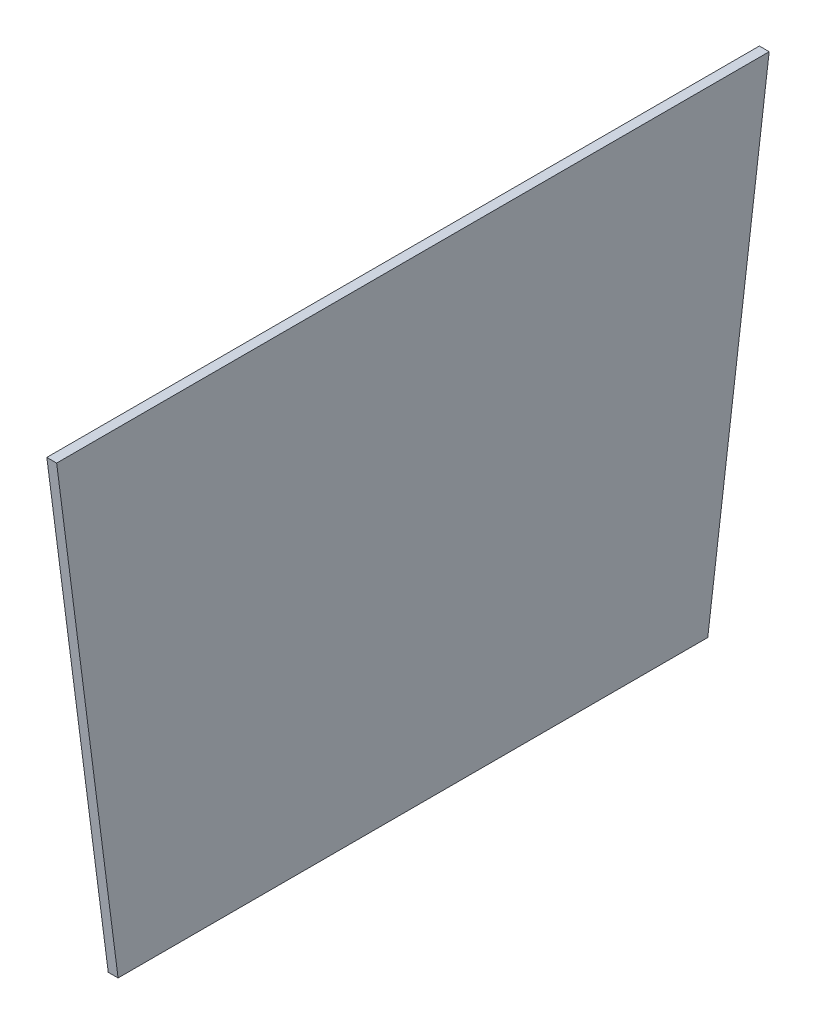
ISO-10303-21;
HEADER;
FILE_DESCRIPTION(('STEP AP214'),'2;1');
FILE_NAME('part.step','',(''),(''),'','','');
FILE_SCHEMA(('AUTOMOTIVE_DESIGN { 1 0 10303 214 1 1 1 1 }'));
ENDSEC;
DATA;
#1=APPLICATION_CONTEXT('core data for automotive mechanical design processes');
#2=APPLICATION_PROTOCOL_DEFINITION('international standard','automotive_design',2000,#1);
#3=PRODUCT_CONTEXT('',#1,'mechanical');
#4=PRODUCT('Part','Part','',(#3));
#5=PRODUCT_RELATED_PRODUCT_CATEGORY('part','',(#4));
#6=PRODUCT_DEFINITION_FORMATION('','',#4);
#7=PRODUCT_DEFINITION_CONTEXT('part definition',#1,'design');
#8=PRODUCT_DEFINITION('design','',#6,#7);
#9=PRODUCT_DEFINITION_SHAPE('','',#8);
#10=(LENGTH_UNIT() NAMED_UNIT(*) SI_UNIT(.MILLI.,.METRE.));
#11=(NAMED_UNIT(*) PLANE_ANGLE_UNIT() SI_UNIT($,.RADIAN.));
#12=(NAMED_UNIT(*) SI_UNIT($,.STERADIAN.) SOLID_ANGLE_UNIT());
#13=UNCERTAINTY_MEASURE_WITH_UNIT(LENGTH_MEASURE(1.E-05),#10,'distance_accuracy_value','');
#14=(GEOMETRIC_REPRESENTATION_CONTEXT(3) GLOBAL_UNCERTAINTY_ASSIGNED_CONTEXT((#13)) GLOBAL_UNIT_ASSIGNED_CONTEXT((#10,
#11,#12)) REPRESENTATION_CONTEXT('',''));
#15=CARTESIAN_POINT('',(0.,0.,0.));
#16=DIRECTION('',(0.,0.,1.));
#17=DIRECTION('',(1.,0.,0.));
#18=AXIS2_PLACEMENT_3D('',#15,#16,#17);
#19=CARTESIAN_POINT('',(5.08,0.,152.4));
#20=DIRECTION('',(0.,0.127809121680115,-0.991798784237689));
#21=DIRECTION('',(0.,0.991798784237689,0.127809121680115));
#22=AXIS2_PLACEMENT_3D('',#19,#20,#21);
#23=PLANE('',#22);
#24=DIRECTION('',(0.,-0.991798784237689,-0.127809121680115));
#25=VECTOR('',#24,1.);
#26=CARTESIAN_POINT('',(0.,0.,152.4));
#27=LINE('',#26,#25);
#28=CARTESIAN_POINT('',(0.,246.38,184.15));
#29=VERTEX_POINT('',#28);
#30=CARTESIAN_POINT('',(0.,0.,152.4));
#31=VERTEX_POINT('',#30);
#32=EDGE_CURVE('E101',#29,#31,#27,.T.);
#33=ORIENTED_EDGE('',*,*,#32,.T.);
#34=DIRECTION('',(-1.,0.,0.));
#35=VECTOR('',#34,1.);
#36=CARTESIAN_POINT('',(5.08,0.,152.4));
#37=LINE('',#36,#35);
#38=CARTESIAN_POINT('',(5.08,0.,152.4));
#39=VERTEX_POINT('',#38);
#40=EDGE_CURVE('E11',#39,#31,#37,.T.);
#41=ORIENTED_EDGE('',*,*,#40,.F.);
#42=DIRECTION('',(0.,-0.991798784237689,-0.127809121680115));
#43=VECTOR('',#42,1.);
#44=CARTESIAN_POINT('',(5.08,0.,152.4));
#45=LINE('',#44,#43);
#46=CARTESIAN_POINT('',(5.08,246.38,184.15));
#47=VERTEX_POINT('',#46);
#48=EDGE_CURVE('E89',#47,#39,#45,.T.);
#49=ORIENTED_EDGE('',*,*,#48,.F.);
#50=DIRECTION('',(-1.,0.,0.));
#51=VECTOR('',#50,1.);
#52=CARTESIAN_POINT('',(5.08,246.38,184.15));
#53=LINE('',#52,#51);
#54=EDGE_CURVE('E97',#47,#29,#53,.T.);
#55=ORIENTED_EDGE('',*,*,#54,.T.);
#56=EDGE_LOOP('',(#33,#41,#49,#55));
#57=FACE_BOUND('',#56,.T.);
#58=ADVANCED_FACE('F38',(#57),#23,.F.);
#59=CARTESIAN_POINT('',(5.08,0.,-152.4));
#60=DIRECTION('',(0.,1.,0.));
#61=DIRECTION('',(0.,0.,1.));
#62=AXIS2_PLACEMENT_3D('',#59,#60,#61);
#63=PLANE('',#62);
#64=DIRECTION('',(0.,0.,-1.));
#65=VECTOR('',#64,1.);
#66=CARTESIAN_POINT('',(0.,0.,-152.4));
#67=LINE('',#66,#65);
#68=CARTESIAN_POINT('',(0.,0.,-152.4));
#69=VERTEX_POINT('',#68);
#70=EDGE_CURVE('E93',#31,#69,#67,.T.);
#71=ORIENTED_EDGE('',*,*,#70,.T.);
#72=DIRECTION('',(-1.,0.,0.));
#73=VECTOR('',#72,1.);
#74=CARTESIAN_POINT('',(5.08,0.,-152.4));
#75=LINE('',#74,#73);
#76=CARTESIAN_POINT('',(5.08,0.,-152.4));
#77=VERTEX_POINT('',#76);
#78=EDGE_CURVE('E46',#77,#69,#75,.T.);
#79=ORIENTED_EDGE('',*,*,#78,.F.);
#80=DIRECTION('',(0.,0.,-1.));
#81=VECTOR('',#80,1.);
#82=CARTESIAN_POINT('',(5.08,0.,-152.4));
#83=LINE('',#82,#81);
#84=EDGE_CURVE('E84',#39,#77,#83,.T.);
#85=ORIENTED_EDGE('',*,*,#84,.F.);
#86=ORIENTED_EDGE('',*,*,#40,.T.);
#87=EDGE_LOOP('',(#71,#79,#85,#86));
#88=FACE_BOUND('',#87,.T.);
#89=ADVANCED_FACE('F92',(#88),#63,.F.);
#90=CARTESIAN_POINT('',(5.08,246.38,-184.15));
#91=DIRECTION('',(0.,0.127809121680115,0.991798784237689));
#92=DIRECTION('',(0.,-0.991798784237689,0.127809121680115));
#93=AXIS2_PLACEMENT_3D('',#90,#91,#92);
#94=PLANE('',#93);
#95=DIRECTION('',(0.,0.991798784237689,-0.127809121680115));
#96=VECTOR('',#95,1.);
#97=CARTESIAN_POINT('',(0.,246.38,-184.15));
#98=LINE('',#97,#96);
#99=CARTESIAN_POINT('',(0.,246.38,-184.15));
#100=VERTEX_POINT('',#99);
#101=EDGE_CURVE('E71',#69,#100,#98,.T.);
#102=ORIENTED_EDGE('',*,*,#101,.T.);
#103=DIRECTION('',(-1.,0.,0.));
#104=VECTOR('',#103,1.);
#105=CARTESIAN_POINT('',(5.08,246.38,-184.15));
#106=LINE('',#105,#104);
#107=CARTESIAN_POINT('',(5.08,246.38,-184.15));
#108=VERTEX_POINT('',#107);
#109=EDGE_CURVE('E94',#108,#100,#106,.T.);
#110=ORIENTED_EDGE('',*,*,#109,.F.);
#111=DIRECTION('',(0.,0.991798784237689,-0.127809121680115));
#112=VECTOR('',#111,1.);
#113=CARTESIAN_POINT('',(5.08,246.38,-184.15));
#114=LINE('',#113,#112);
#115=EDGE_CURVE('E87',#77,#108,#114,.T.);
#116=ORIENTED_EDGE('',*,*,#115,.F.);
#117=ORIENTED_EDGE('',*,*,#78,.T.);
#118=EDGE_LOOP('',(#102,#110,#116,#117));
#119=FACE_BOUND('',#118,.T.);
#120=ADVANCED_FACE('F95',(#119),#94,.F.);
#121=CARTESIAN_POINT('',(5.08,246.38,184.15));
#122=DIRECTION('',(0.,-1.,0.));
#123=DIRECTION('',(0.,0.,-1.));
#124=AXIS2_PLACEMENT_3D('',#121,#122,#123);
#125=PLANE('',#124);
#126=DIRECTION('',(0.,0.,1.));
#127=VECTOR('',#126,1.);
#128=CARTESIAN_POINT('',(0.,246.38,184.15));
#129=LINE('',#128,#127);
#130=EDGE_CURVE('E77',#100,#29,#129,.T.);
#131=ORIENTED_EDGE('',*,*,#130,.T.);
#132=ORIENTED_EDGE('',*,*,#54,.F.);
#133=DIRECTION('',(0.,0.,1.));
#134=VECTOR('',#133,1.);
#135=CARTESIAN_POINT('',(5.08,246.38,184.15));
#136=LINE('',#135,#134);
#137=EDGE_CURVE('E54',#108,#47,#136,.T.);
#138=ORIENTED_EDGE('',*,*,#137,.F.);
#139=ORIENTED_EDGE('',*,*,#109,.T.);
#140=EDGE_LOOP('',(#131,#132,#138,#139));
#141=FACE_BOUND('',#140,.T.);
#142=ADVANCED_FACE('F108',(#141),#125,.F.);
#143=CARTESIAN_POINT('',(5.08,0.,0.));
#144=DIRECTION('',(-1.,0.,0.));
#145=DIRECTION('',(0.,0.,1.));
#146=AXIS2_PLACEMENT_3D('',#143,#144,#145);
#147=PLANE('',#146);
#148=ORIENTED_EDGE('',*,*,#48,.T.);
#149=ORIENTED_EDGE('',*,*,#84,.T.);
#150=ORIENTED_EDGE('',*,*,#115,.T.);
#151=ORIENTED_EDGE('',*,*,#137,.T.);
#152=EDGE_LOOP('',(#148,#149,#150,#151));
#153=FACE_BOUND('',#152,.T.);
#154=ADVANCED_FACE('F85',(#153),#147,.F.);
#155=CARTESIAN_POINT('',(0.,0.,0.));
#156=DIRECTION('',(-1.,0.,0.));
#157=DIRECTION('',(0.,0.,1.));
#158=AXIS2_PLACEMENT_3D('',#155,#156,#157);
#159=PLANE('',#158);
#160=ORIENTED_EDGE('',*,*,#32,.F.);
#161=ORIENTED_EDGE('',*,*,#130,.F.);
#162=ORIENTED_EDGE('',*,*,#101,.F.);
#163=ORIENTED_EDGE('',*,*,#70,.F.);
#164=EDGE_LOOP('',(#160,#161,#162,#163));
#165=FACE_BOUND('',#164,.T.);
#166=ADVANCED_FACE('F111',(#165),#159,.T.);
#167=CLOSED_SHELL('',(#58,#89,#120,#142,#154,#166));
#168=MANIFOLD_SOLID_BREP('B2',#167);
#169=ADVANCED_BREP_SHAPE_REPRESENTATION('',(#18,#168),#14);
#170=SHAPE_DEFINITION_REPRESENTATION(#9,#169);
ENDSEC;
END-ISO-10303-21;
